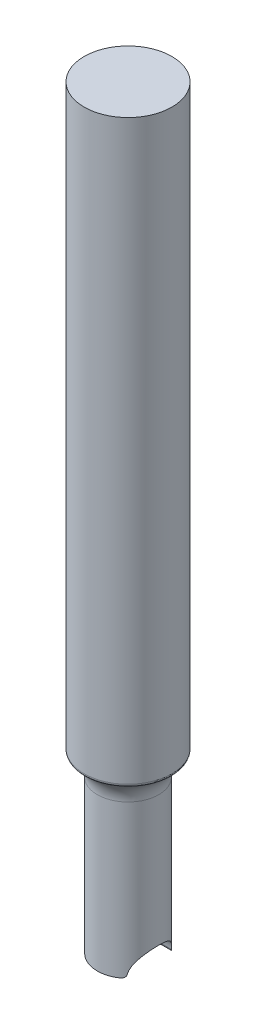
ISO-10303-21;
HEADER;
FILE_DESCRIPTION(('STEP AP214'),'2;1');
FILE_NAME('part.step','',(''),(''),'','','');
FILE_SCHEMA(('AUTOMOTIVE_DESIGN { 1 0 10303 214 1 1 1 1 }'));
ENDSEC;
DATA;
#1=APPLICATION_CONTEXT('core data for automotive mechanical design processes');
#2=APPLICATION_PROTOCOL_DEFINITION('international standard','automotive_design',2000,#1);
#3=PRODUCT_CONTEXT('',#1,'mechanical');
#4=PRODUCT('Part','Part','',(#3));
#5=PRODUCT_RELATED_PRODUCT_CATEGORY('part','',(#4));
#6=PRODUCT_DEFINITION_FORMATION('','',#4);
#7=PRODUCT_DEFINITION_CONTEXT('part definition',#1,'design');
#8=PRODUCT_DEFINITION('design','',#6,#7);
#9=PRODUCT_DEFINITION_SHAPE('','',#8);
#10=(LENGTH_UNIT() NAMED_UNIT(*) SI_UNIT(.MILLI.,.METRE.));
#11=(NAMED_UNIT(*) PLANE_ANGLE_UNIT() SI_UNIT($,.RADIAN.));
#12=(NAMED_UNIT(*) SI_UNIT($,.STERADIAN.) SOLID_ANGLE_UNIT());
#13=UNCERTAINTY_MEASURE_WITH_UNIT(LENGTH_MEASURE(1.E-05),#10,'distance_accuracy_value','');
#14=(GEOMETRIC_REPRESENTATION_CONTEXT(3) GLOBAL_UNCERTAINTY_ASSIGNED_CONTEXT((#13)) GLOBAL_UNIT_ASSIGNED_CONTEXT((#10,
#11,#12)) REPRESENTATION_CONTEXT('',''));
#15=CARTESIAN_POINT('',(0.,0.,0.));
#16=DIRECTION('',(0.,0.,1.));
#17=DIRECTION('',(1.,0.,0.));
#18=AXIS2_PLACEMENT_3D('',#15,#16,#17);
#19=CARTESIAN_POINT('',(0.,-25.4,0.));
#20=DIRECTION('',(0.,1.,0.));
#21=DIRECTION('',(0.,0.,1.));
#22=AXIS2_PLACEMENT_3D('',#19,#20,#21);
#23=PLANE('',#22);
#24=CARTESIAN_POINT('',(0.,-25.4,0.));
#25=DIRECTION('',(0.,1.,0.));
#26=DIRECTION('',(0.,0.,1.));
#27=AXIS2_PLACEMENT_3D('',#24,#25,#26);
#28=CIRCLE('',#27,4.445);
#29=CARTESIAN_POINT('',(-2.44536842827415,-25.4,3.71189954740157));
#30=VERTEX_POINT('',#29);
#31=CARTESIAN_POINT('',(2.44536842827415,-25.4,3.71189954740157));
#32=VERTEX_POINT('',#31);
#33=EDGE_CURVE('E92',#30,#32,#28,.T.);
#34=ORIENTED_EDGE('',*,*,#33,.F.);
#35=DIRECTION('',(1.,0.,0.));
#36=VECTOR('',#35,1.);
#37=CARTESIAN_POINT('',(0.,-25.4,3.71189954740157));
#38=LINE('',#37,#36);
#39=EDGE_CURVE('E11',#30,#32,#38,.T.);
#40=ORIENTED_EDGE('',*,*,#39,.T.);
#41=EDGE_LOOP('',(#34,#40));
#42=FACE_BOUND('',#41,.T.);
#43=ADVANCED_FACE('F39',(#42),#23,.F.);
#44=CARTESIAN_POINT('',(0.,83.82,0.));
#45=DIRECTION('',(0.,-1.,0.));
#46=DIRECTION('',(0.,0.,-1.));
#47=AXIS2_PLACEMENT_3D('',#44,#45,#46);
#48=CYLINDRICAL_SURFACE('',#47,6.35);
#49=CARTESIAN_POINT('',(0.,0.281302745268691,0.));
#50=DIRECTION('',(0.,-1.,0.));
#51=DIRECTION('',(0.,0.,-1.));
#52=AXIS2_PLACEMENT_3D('',#49,#50,#51);
#53=CIRCLE('',#52,6.35);
#54=CARTESIAN_POINT('',(0.,0.281302745268691,-6.35));
#55=VERTEX_POINT('',#54);
#56=EDGE_CURVE('E103',#55,#55,#53,.F.);
#57=ORIENTED_EDGE('',*,*,#56,.T.);
#58=EDGE_LOOP('',(#57));
#59=FACE_BOUND('',#58,.T.);
#60=CARTESIAN_POINT('',(0.,83.82,0.));
#61=DIRECTION('',(0.,1.,0.));
#62=DIRECTION('',(0.,0.,1.));
#63=AXIS2_PLACEMENT_3D('',#60,#61,#62);
#64=CIRCLE('',#63,6.35);
#65=CARTESIAN_POINT('',(0.,83.82,6.35));
#66=VERTEX_POINT('',#65);
#67=EDGE_CURVE('E94',#66,#66,#64,.T.);
#68=ORIENTED_EDGE('',*,*,#67,.F.);
#69=EDGE_LOOP('',(#68));
#70=FACE_BOUND('',#69,.T.);
#71=ADVANCED_FACE('F161',(#59,#70),#48,.T.);
#72=CARTESIAN_POINT('',(0.,83.82,0.));
#73=DIRECTION('',(0.,1.,0.));
#74=DIRECTION('',(0.,0.,1.));
#75=AXIS2_PLACEMENT_3D('',#72,#73,#74);
#76=PLANE('',#75);
#77=ORIENTED_EDGE('',*,*,#67,.T.);
#78=EDGE_LOOP('',(#77));
#79=FACE_BOUND('',#78,.T.);
#80=ADVANCED_FACE('F117',(#79),#76,.T.);
#81=CARTESIAN_POINT('',(0.,-25.4,0.));
#82=DIRECTION('',(0.,1.,0.));
#83=DIRECTION('',(0.,0.,1.));
#84=AXIS2_PLACEMENT_3D('',#81,#82,#83);
#85=CYLINDRICAL_SURFACE('',#84,4.445);
#86=CARTESIAN_POINT('',(2.44536842827415,-25.4,-3.71189954740157));
#87=VERTEX_POINT('',#86);
#88=CARTESIAN_POINT('',(-2.44536842827415,-25.4,-3.71189954740157));
#89=VERTEX_POINT('',#88);
#90=EDGE_CURVE('E81',#87,#89,#28,.T.);
#91=ORIENTED_EDGE('',*,*,#90,.T.);
#92=CARTESIAN_POINT('',(-2.44536842827415,-25.4,-3.71189954740157));
#93=CARTESIAN_POINT('',(-2.47735636897823,-25.399983898697,-3.69083266025942));
#94=CARTESIAN_POINT('',(-2.50909558964507,-25.3986867688102,-3.669323943575));
#95=CARTESIAN_POINT('',(-2.57200633765344,-25.3930941143963,-3.62550320364989));
#96=CARTESIAN_POINT('',(-2.60317363381565,-25.3887816564863,-3.60318732198382));
#97=CARTESIAN_POINT('',(-2.66493746841726,-25.3766269183203,-3.55775575622036));
#98=CARTESIAN_POINT('',(-2.69551963631302,-25.3687354281383,-3.53463321684989));
#99=CARTESIAN_POINT('',(-2.75517859618385,-25.3488518775097,-3.48832832424946));
#100=CARTESIAN_POINT('',(-2.78425912752254,-25.3368706307623,-3.46514628715513));
#101=CARTESIAN_POINT('',(-2.83603154759458,-25.3103715519963,-3.42284791777214));
#102=CARTESIAN_POINT('',(-2.85901273985272,-25.2965401156949,-3.40366104612556));
#103=CARTESIAN_POINT('',(-2.90300834204553,-25.2650457738632,-3.36621436323329));
#104=CARTESIAN_POINT('',(-2.92402546443731,-25.2473882676471,-3.3479532898708));
#105=CARTESIAN_POINT('',(-2.96371082106707,-25.2075326960651,-3.31287710734077));
#106=CARTESIAN_POINT('',(-2.98233767376959,-25.1852685948839,-3.29608874715065));
#107=CARTESIAN_POINT('',(-3.01572307862446,-25.1362909954903,-3.26557013022498));
#108=CARTESIAN_POINT('',(-3.03050188223043,-25.109602052789,-3.25182392318687));
#109=CARTESIAN_POINT('',(-3.05063020749444,-25.0624204827453,-3.23292461387663));
#110=CARTESIAN_POINT('',(-3.05746484426624,-25.0430890083935,-3.22645308511387));
#111=CARTESIAN_POINT('',(-3.06874813600373,-25.0029598683544,-3.21572158026461));
#112=CARTESIAN_POINT('',(-3.07317404498164,-24.9821502543822,-3.21148269907662));
#113=CARTESIAN_POINT('',(-3.07619374122761,-24.9608813559322,-3.20859113419458));
#114=B_SPLINE_CURVE_WITH_KNOTS('',3,(#92,#93,#94,#95,#96,#97,#98,#99,#100,#101,#102,#103,#104,
#105,#106,#107,#108,#109,#110,#111,#112,#113),.UNSPECIFIED.,.F.,.F.,(4,2,2,2,2,2,2,2,2,2,4),(0.,
0.114935253819393,0.230521196169898,0.347746966764257,0.464665152020999,0.563360636302092,
0.6619177391264,0.7619999934923,0.861544374510092,0.925771030703431,0.990594106141183),.UNSPECIFIED.);
#115=CARTESIAN_POINT('',(-3.07619374122761,-24.9608813559322,-3.20859113419458));
#116=VERTEX_POINT('',#115);
#117=EDGE_CURVE('E86',#89,#116,#114,.T.);
#118=ORIENTED_EDGE('',*,*,#117,.T.);
#119=CARTESIAN_POINT('',(-3.04469091206316,-25.4,3.2385));
#120=CARTESIAN_POINT('',(-3.04463501457511,-25.3227829190388,3.23852362398881));
#121=CARTESIAN_POINT('',(-3.0476269699606,-25.2456031918844,3.23573946671245));
#122=CARTESIAN_POINT('',(-3.05927055560037,-25.0921990767109,3.22474831913488));
#123=CARTESIAN_POINT('',(-3.06791173348939,-25.0159731888033,3.21655134351499));
#124=CARTESIAN_POINT('',(-3.09028583984496,-24.8659710161894,3.19505555921046));
#125=CARTESIAN_POINT('',(-3.10395652325404,-24.7921763245362,3.18181905261877));
#126=CARTESIAN_POINT('',(-3.13571848282549,-24.6465841123561,3.15052299878193));
#127=CARTESIAN_POINT('',(-3.15381161074949,-24.5747874425023,3.13246143089659));
#128=CARTESIAN_POINT('',(-3.21331054108659,-24.3639969920997,3.07178136357645));
#129=CARTESIAN_POINT('',(-3.26013620416133,-24.2284050266954,3.02248798676109));
#130=CARTESIAN_POINT('',(-3.36272413020834,-23.9674235981944,2.90792692787263));
#131=CARTESIAN_POINT('',(-3.41851708273087,-23.8420714855115,2.84260396668927));
#132=CARTESIAN_POINT('',(-3.54539562579196,-23.5791833304891,2.68336531027762));
#133=CARTESIAN_POINT('',(-3.61735919341776,-23.4439374909422,2.58636704693851));
#134=CARTESIAN_POINT('',(-3.76097919093719,-23.1896124270349,2.37268757030682));
#135=CARTESIAN_POINT('',(-3.83263542744169,-23.0705422488822,2.25599542437271));
#136=CARTESIAN_POINT('',(-3.94235774743699,-22.8950809330248,2.05503029713733));
#137=CARTESIAN_POINT('',(-3.98226477778402,-22.8328486011256,1.97679248458371));
#138=CARTESIAN_POINT('',(-4.05904104958174,-22.7152918801453,1.8139199285299));
#139=CARTESIAN_POINT('',(-4.09591166682149,-22.6599643565953,1.72928811583206));
#140=CARTESIAN_POINT('',(-4.16554863030361,-22.5569222424514,1.55405983803135));
#141=CARTESIAN_POINT('',(-4.19832025383074,-22.5091978410132,1.46347127624383));
#142=CARTESIAN_POINT('',(-4.2587961926473,-22.4220503673835,1.27683553185076));
#143=CARTESIAN_POINT('',(-4.28650297440932,-22.3826232531634,1.18079103620123));
#144=CARTESIAN_POINT('',(-4.34639425116467,-22.298025367917,0.942177443725427));
#145=CARTESIAN_POINT('',(-4.3755079744863,-22.2574903104058,0.797126958342061));
#146=CARTESIAN_POINT('',(-4.41923550175928,-22.1968858580611,0.500789531311265));
#147=CARTESIAN_POINT('',(-4.43386173385439,-22.1767989213265,0.349508051204502));
#148=CARTESIAN_POINT('',(-4.4474009553188,-22.158198683788,0.0445390155790578));
#149=CARTESIAN_POINT('',(-4.44627757291098,-22.1597353199686,-0.109153290303072));
#150=CARTESIAN_POINT('',(-4.42832397827729,-22.1844160378933,-0.413864221876423));
#151=CARTESIAN_POINT('',(-4.41148973338961,-22.2075656672578,-0.56488215096749));
#152=CARTESIAN_POINT('',(-4.36428748651281,-22.2731230118493,-0.855628853142713));
#153=CARTESIAN_POINT('',(-4.33432952238349,-22.3149479447907,-0.995558590299206));
#154=CARTESIAN_POINT('',(-4.26319285681044,-22.4157176551135,-1.26601363931461));
#155=CARTESIAN_POINT('',(-4.22201182285294,-22.4746659914551,-1.39653698908651));
#156=CARTESIAN_POINT('',(-4.12597517765704,-22.614962136051,-1.66016527219585));
#157=CARTESIAN_POINT('',(-4.07011147431638,-22.6980650703127,-1.79196242497871));
#158=CARTESIAN_POINT('',(-3.95141814137029,-22.8804058077636,-2.04042099719444));
#159=CARTESIAN_POINT('',(-3.88858215959724,-22.9796583632666,-2.15706840081689));
#160=CARTESIAN_POINT('',(-3.7475610024905,-23.2126969034373,-2.39507188014702));
#161=CARTESIAN_POINT('',(-3.66872415640257,-23.3494625898154,-2.5131288667004));
#162=CARTESIAN_POINT('',(-3.5136865740353,-23.6418036379969,-2.72567596518718));
#163=CARTESIAN_POINT('',(-3.43748729204232,-23.7973891706177,-2.82015324868712));
#164=CARTESIAN_POINT('',(-3.31208690872826,-24.0910428380792,-2.96568058635567));
#165=CARTESIAN_POINT('',(-3.26060622198569,-24.2256621624654,-3.02170157105747));
#166=CARTESIAN_POINT('',(-3.17084541598623,-24.5047966911866,-3.11576774320867));
#167=CARTESIAN_POINT('',(-3.13250750230748,-24.6492651309372,-3.15389191145322));
#168=CARTESIAN_POINT('',(-3.08474446441768,-24.8953082994337,-3.20048159070717));
#169=CARTESIAN_POINT('',(-3.06992038182991,-24.9947571099544,-3.21462451265105));
#170=CARTESIAN_POINT('',(-3.05488745124757,-25.1455871314794,-3.2288902663572));
#171=CARTESIAN_POINT('',(-3.051076484664,-25.1963057711384,-3.23248766247769));
#172=CARTESIAN_POINT('',(-3.04597303959414,-25.2980115489488,-3.23729495409034));
#173=CARTESIAN_POINT('',(-3.04468204100156,-25.3489988272517,-3.23850344666387));
#174=CARTESIAN_POINT('',(-3.04469091206316,-25.4,-3.2385));
#175=B_SPLINE_CURVE_WITH_KNOTS('',3,(#119,#120,#121,#122,#123,#124,#125,#126,#127,#128,#129,
#130,#131,#132,#133,#134,#135,#136,#137,#138,#139,#140,#141,#142,#143,#144,#145,#146,#147,#148,
#149,#150,#151,#152,#153,#154,#155,#156,#157,#158,#159,#160,#161,#162,#163,#164,#165,#166,#167,
#168,#169,#170,#171,#172,#173,#174),.UNSPECIFIED.,.F.,.F.,(4,2,2,2,2,2,2,2,2,2,2,2,2,2,2,2,2,2,
2,2,2,2,2,2,2,2,2,4),(0.,0.231483188316698,0.462539286867695,0.690827084797741,
0.919210635415079,1.37234275602033,1.82706005293908,2.36919095895382,2.9116238133834,
3.2341575115991,3.55654425744455,3.87851157528318,4.20032168159876,4.65838124198546,
5.11604751321218,5.57477088156215,6.03361202735036,6.47903925278616,6.92455912297249,
7.41929745005755,7.91449027310827,8.50355403606966,9.09293758138883,9.55532826415171,
10.0156587194569,10.3194000967155,10.4722573043451,10.6252042529729),.UNSPECIFIED.);
#176=CARTESIAN_POINT('',(-3.07619374122761,-24.9608813559322,3.20859113419458));
#177=VERTEX_POINT('',#176);
#178=EDGE_CURVE('E134',#177,#116,#175,.T.);
#179=ORIENTED_EDGE('',*,*,#178,.F.);
#180=CARTESIAN_POINT('',(-3.07619374122761,-24.9608813559322,3.20859113419458));
#181=CARTESIAN_POINT('',(-3.07281307098173,-24.9847651494615,3.21182791396686));
#182=CARTESIAN_POINT('',(-3.067647632525,-25.0080563303613,3.21677512736445));
#183=CARTESIAN_POINT('',(-3.05430776702419,-25.0527049891377,3.22944562550276));
#184=CARTESIAN_POINT('',(-3.04616402443686,-25.0740795117107,3.23714058273036));
#185=CARTESIAN_POINT('',(-3.02738542213801,-25.1145488270994,3.25470793333221));
#186=CARTESIAN_POINT('',(-3.01676267300753,-25.1336540423578,3.26456972787488));
#187=CARTESIAN_POINT('',(-2.99346602365788,-25.1696064519168,3.28594559788082));
#188=CARTESIAN_POINT('',(-2.98078656139854,-25.1864472901496,3.29746414390747));
#189=CARTESIAN_POINT('',(-2.94643816133572,-25.2263989121021,3.32825842054909));
#190=CARTESIAN_POINT('',(-2.92363881137343,-25.2479178291146,3.3483378049802));
#191=CARTESIAN_POINT('',(-2.87533291011181,-25.2859354009756,3.38991323034801));
#192=CARTESIAN_POINT('',(-2.84982067930178,-25.3024232325021,3.41141220613566));
#193=CARTESIAN_POINT('',(-2.78282318442186,-25.3385843823729,3.46650476867466));
#194=CARTESIAN_POINT('',(-2.74004979398578,-25.3553001397103,3.50045862440874));
#195=CARTESIAN_POINT('',(-2.65177248658745,-25.3804617150549,3.56780513492891));
#196=CARTESIAN_POINT('',(-2.60626414354188,-25.3888937226321,3.60119676162168));
#197=CARTESIAN_POINT('',(-2.54103877055546,-25.3960349422759,3.64714732249885));
#198=CARTESIAN_POINT('',(-2.52201492182049,-25.3975448156095,3.6603282560082));
#199=CARTESIAN_POINT('',(-2.48381677234502,-25.3995243295801,3.68635460545873));
#200=CARTESIAN_POINT('',(-2.46464360832944,-25.3999988550861,3.69920131316295));
#201=CARTESIAN_POINT('',(-2.44536842827416,-25.4,3.71189954740157));
#202=B_SPLINE_CURVE_WITH_KNOTS('',3,(#180,#181,#182,#183,#184,#185,#186,#187,#188,#189,#190,
#191,#192,#193,#194,#195,#196,#197,#198,#199,#200,#201),.UNSPECIFIED.,.F.,.F.,(4,2,2,2,2,2,2,2,
2,2,4),(0.,0.0727329787595142,0.14473680435088,0.216395976034261,0.288252271903851,
0.399310864059385,0.510606717819431,0.681001672516374,0.851680225136154,0.921240556494678,
0.990471979439484),.UNSPECIFIED.);
#203=EDGE_CURVE('E98',#177,#30,#202,.T.);
#204=ORIENTED_EDGE('',*,*,#203,.T.);
#205=ORIENTED_EDGE('',*,*,#33,.T.);
#206=CARTESIAN_POINT('',(2.44536842827415,-25.4,3.71189954740157));
#207=CARTESIAN_POINT('',(2.47735636897823,-25.399983898697,3.69083266025942));
#208=CARTESIAN_POINT('',(2.50909558964507,-25.3986867688102,3.669323943575));
#209=CARTESIAN_POINT('',(2.57200633765344,-25.3930941143963,3.62550320364989));
#210=CARTESIAN_POINT('',(2.60317363381565,-25.3887816564863,3.60318732198382));
#211=CARTESIAN_POINT('',(2.66493746841726,-25.3766269183203,3.55775575622036));
#212=CARTESIAN_POINT('',(2.69551963631302,-25.3687354281383,3.53463321684989));
#213=CARTESIAN_POINT('',(2.75517859618385,-25.3488518775097,3.48832832424946));
#214=CARTESIAN_POINT('',(2.78425912752254,-25.3368706307623,3.46514628715513));
#215=CARTESIAN_POINT('',(2.83603154759458,-25.3103715519963,3.42284791777214));
#216=CARTESIAN_POINT('',(2.85901273985272,-25.2965401156949,3.40366104612556));
#217=CARTESIAN_POINT('',(2.90300834204553,-25.2650457738632,3.36621436323329));
#218=CARTESIAN_POINT('',(2.92402546443731,-25.2473882676471,3.3479532898708));
#219=CARTESIAN_POINT('',(2.96371082106707,-25.2075326960651,3.31287710734077));
#220=CARTESIAN_POINT('',(2.98233767376959,-25.1852685948839,3.29608874715065));
#221=CARTESIAN_POINT('',(3.01572307862446,-25.1362909954903,3.26557013022498));
#222=CARTESIAN_POINT('',(3.03050188223043,-25.109602052789,3.25182392318687));
#223=CARTESIAN_POINT('',(3.05063020749444,-25.0624204827453,3.23292461387663));
#224=CARTESIAN_POINT('',(3.05746484426624,-25.0430890083935,3.22645308511387));
#225=CARTESIAN_POINT('',(3.06874813600373,-25.0029598683544,3.21572158026461));
#226=CARTESIAN_POINT('',(3.07317404498164,-24.9821502543822,3.21148269907662));
#227=CARTESIAN_POINT('',(3.07619374122761,-24.9608813559322,3.20859113419458));
#228=B_SPLINE_CURVE_WITH_KNOTS('',3,(#206,#207,#208,#209,#210,#211,#212,#213,#214,#215,#216,
#217,#218,#219,#220,#221,#222,#223,#224,#225,#226,#227),.UNSPECIFIED.,.F.,.F.,(4,2,2,2,2,2,2,2,
2,2,4),(0.,0.114935253819393,0.230521196169898,0.347746966764256,0.464665152020998,
0.563360636302092,0.6619177391264,0.7619999934923,0.861544374510092,0.925771030703431,
0.990594106141183),.UNSPECIFIED.);
#229=CARTESIAN_POINT('',(3.07619374122762,-24.9608813559322,3.20859113419458));
#230=VERTEX_POINT('',#229);
#231=EDGE_CURVE('E54',#32,#230,#228,.T.);
#232=ORIENTED_EDGE('',*,*,#231,.T.);
#233=CARTESIAN_POINT('',(3.04469091206316,-25.4,-3.2385));
#234=CARTESIAN_POINT('',(3.04463501457511,-25.3227829190388,-3.23852362398881));
#235=CARTESIAN_POINT('',(3.0476269699606,-25.2456031918844,-3.23573946671245));
#236=CARTESIAN_POINT('',(3.05927055560037,-25.0921990767109,-3.22474831913488));
#237=CARTESIAN_POINT('',(3.06791173348939,-25.0159731888033,-3.21655134351499));
#238=CARTESIAN_POINT('',(3.09028583984496,-24.8659710161894,-3.19505555921046));
#239=CARTESIAN_POINT('',(3.10395652325404,-24.7921763245362,-3.18181905261877));
#240=CARTESIAN_POINT('',(3.13571848282549,-24.6465841123561,-3.15052299878193));
#241=CARTESIAN_POINT('',(3.15381161074949,-24.5747874425023,-3.13246143089659));
#242=CARTESIAN_POINT('',(3.21331054108659,-24.3639969920997,-3.07178136357645));
#243=CARTESIAN_POINT('',(3.26013620416132,-24.2284050266954,-3.0224879867611));
#244=CARTESIAN_POINT('',(3.36272413020834,-23.9674235981944,-2.90792692787263));
#245=CARTESIAN_POINT('',(3.41851708273087,-23.8420714855115,-2.84260396668928));
#246=CARTESIAN_POINT('',(3.54539562579195,-23.5791833304891,-2.68336531027762));
#247=CARTESIAN_POINT('',(3.61735919341776,-23.4439374909422,-2.58636704693851));
#248=CARTESIAN_POINT('',(3.76097919093719,-23.1896124270349,-2.37268757030682));
#249=CARTESIAN_POINT('',(3.83263542744168,-23.0705422488822,-2.25599542437272));
#250=CARTESIAN_POINT('',(3.94235774743699,-22.8950809330248,-2.05503029713734));
#251=CARTESIAN_POINT('',(3.98226477778402,-22.8328486011256,-1.97679248458371));
#252=CARTESIAN_POINT('',(4.05904104958174,-22.7152918801453,-1.8139199285299));
#253=CARTESIAN_POINT('',(4.09591166682149,-22.6599643565953,-1.72928811583207));
#254=CARTESIAN_POINT('',(4.16554863030361,-22.5569222424514,-1.55405983803135));
#255=CARTESIAN_POINT('',(4.19832025383074,-22.5091978410132,-1.46347127624383));
#256=CARTESIAN_POINT('',(4.25879619264729,-22.4220503673835,-1.27683553185076));
#257=CARTESIAN_POINT('',(4.28650297440932,-22.3826232531634,-1.18079103620123));
#258=CARTESIAN_POINT('',(4.34639425116467,-22.298025367917,-0.942177443725432));
#259=CARTESIAN_POINT('',(4.3755079744863,-22.2574903104058,-0.797126958342066));
#260=CARTESIAN_POINT('',(4.41923550175928,-22.1968858580611,-0.50078953131127));
#261=CARTESIAN_POINT('',(4.43386173385439,-22.1767989213265,-0.349508051204507));
#262=CARTESIAN_POINT('',(4.4474009553188,-22.158198683788,-0.0445390155790621));
#263=CARTESIAN_POINT('',(4.44627757291098,-22.1597353199686,0.109153290303069));
#264=CARTESIAN_POINT('',(4.42832397827729,-22.1844160378933,0.413864221876419));
#265=CARTESIAN_POINT('',(4.41148973338961,-22.2075656672578,0.564882150967487));
#266=CARTESIAN_POINT('',(4.36428748651281,-22.2731230118493,0.855628853142709));
#267=CARTESIAN_POINT('',(4.33432952238349,-22.3149479447907,0.995558590299202));
#268=CARTESIAN_POINT('',(4.26319285681044,-22.4157176551135,1.26601363931461));
#269=CARTESIAN_POINT('',(4.22201182285294,-22.4746659914551,1.3965369890865));
#270=CARTESIAN_POINT('',(4.12597517765704,-22.614962136051,1.66016527219585));
#271=CARTESIAN_POINT('',(4.07011147431638,-22.6980650703127,1.79196242497871));
#272=CARTESIAN_POINT('',(3.95141814137029,-22.8804058077636,2.04042099719444));
#273=CARTESIAN_POINT('',(3.88858215959724,-22.9796583632666,2.15706840081689));
#274=CARTESIAN_POINT('',(3.7475610024905,-23.2126969034373,2.39507188014702));
#275=CARTESIAN_POINT('',(3.66872415640257,-23.3494625898154,2.5131288667004));
#276=CARTESIAN_POINT('',(3.51368657403531,-23.6418036379969,2.72567596518717));
#277=CARTESIAN_POINT('',(3.43748729204232,-23.7973891706177,2.82015324868712));
#278=CARTESIAN_POINT('',(3.31208690872826,-24.0910428380792,2.96568058635567));
#279=CARTESIAN_POINT('',(3.26060622198569,-24.2256621624654,3.02170157105747));
#280=CARTESIAN_POINT('',(3.17084541598624,-24.5047966911866,3.11576774320867));
#281=CARTESIAN_POINT('',(3.13250750230748,-24.6492651309372,3.15389191145322));
#282=CARTESIAN_POINT('',(3.08474446441768,-24.8953082994337,3.20048159070717));
#283=CARTESIAN_POINT('',(3.06992038182991,-24.9947571099544,3.21462451265105));
#284=CARTESIAN_POINT('',(3.05488745124757,-25.1455871314794,3.2288902663572));
#285=CARTESIAN_POINT('',(3.051076484664,-25.1963057711384,3.23248766247769));
#286=CARTESIAN_POINT('',(3.04597303959414,-25.2980115489488,3.23729495409034));
#287=CARTESIAN_POINT('',(3.04468204100156,-25.3489988272517,3.23850344666387));
#288=CARTESIAN_POINT('',(3.04469091206316,-25.4,3.2385));
#289=B_SPLINE_CURVE_WITH_KNOTS('',3,(#233,#234,#235,#236,#237,#238,#239,#240,#241,#242,#243,
#244,#245,#246,#247,#248,#249,#250,#251,#252,#253,#254,#255,#256,#257,#258,#259,#260,#261,#262,
#263,#264,#265,#266,#267,#268,#269,#270,#271,#272,#273,#274,#275,#276,#277,#278,#279,#280,#281,
#282,#283,#284,#285,#286,#287,#288),.UNSPECIFIED.,.F.,.F.,(4,2,2,2,2,2,2,2,2,2,2,2,2,2,2,2,2,2,
2,2,2,2,2,2,2,2,2,4),(0.,0.231483188316695,0.462539286867688,0.690827084797741,
0.919210635415076,1.37234275602032,1.82706005293908,2.36919095895381,2.91162381338339,
3.2341575115991,3.55654425744454,3.87851157528318,4.20032168159875,4.65838124198545,
5.11604751321217,5.57477088156215,6.03361202735036,6.47903925278616,6.92455912297249,
7.41929745005755,7.91449027310827,8.50355403606965,9.09293758138883,9.55532826415171,
10.0156587194568,10.3194000967155,10.4722573043451,10.6252042529729),.UNSPECIFIED.);
#290=CARTESIAN_POINT('',(3.07619374122761,-24.9608813559322,-3.20859113419458));
#291=VERTEX_POINT('',#290);
#292=EDGE_CURVE('E83',#291,#230,#289,.T.);
#293=ORIENTED_EDGE('',*,*,#292,.F.);
#294=CARTESIAN_POINT('',(3.07619374122761,-24.9608813559322,-3.20859113419458));
#295=CARTESIAN_POINT('',(3.07281307098173,-24.9847651494615,-3.21182791396686));
#296=CARTESIAN_POINT('',(3.067647632525,-25.0080563303613,-3.21677512736444));
#297=CARTESIAN_POINT('',(3.05430776702419,-25.0527049891377,-3.22944562550276));
#298=CARTESIAN_POINT('',(3.04616402443686,-25.0740795117107,-3.23714058273036));
#299=CARTESIAN_POINT('',(3.02738542213801,-25.1145488270994,-3.25470793333221));
#300=CARTESIAN_POINT('',(3.01676267300753,-25.1336540423578,-3.26456972787488));
#301=CARTESIAN_POINT('',(2.99346602365788,-25.1696064519168,-3.28594559788082));
#302=CARTESIAN_POINT('',(2.98078656139854,-25.1864472901496,-3.29746414390747));
#303=CARTESIAN_POINT('',(2.94643816133572,-25.2263989121021,-3.32825842054909));
#304=CARTESIAN_POINT('',(2.92363881137343,-25.2479178291146,-3.3483378049802));
#305=CARTESIAN_POINT('',(2.8753329101118,-25.2859354009756,-3.38991323034802));
#306=CARTESIAN_POINT('',(2.84982067930177,-25.3024232325021,-3.41141220613566));
#307=CARTESIAN_POINT('',(2.78282318442185,-25.3385843823729,-3.46650476867466));
#308=CARTESIAN_POINT('',(2.74004979398577,-25.3553001397103,-3.50045862440875));
#309=CARTESIAN_POINT('',(2.65177248658744,-25.3804617150549,-3.56780513492892));
#310=CARTESIAN_POINT('',(2.60626414354187,-25.3888937226321,-3.60119676162169));
#311=CARTESIAN_POINT('',(2.54103877055545,-25.3960349422759,-3.64714732249886));
#312=CARTESIAN_POINT('',(2.52201492182048,-25.3975448156095,-3.6603282560082));
#313=CARTESIAN_POINT('',(2.48381677234502,-25.3995243295801,-3.68635460545873));
#314=CARTESIAN_POINT('',(2.46464360832944,-25.3999988550861,-3.69920131316296));
#315=CARTESIAN_POINT('',(2.44536842827416,-25.4,-3.71189954740158));
#316=B_SPLINE_CURVE_WITH_KNOTS('',3,(#294,#295,#296,#297,#298,#299,#300,#301,#302,#303,#304,
#305,#306,#307,#308,#309,#310,#311,#312,#313,#314,#315),.UNSPECIFIED.,.F.,.F.,(4,2,2,2,2,2,2,2,
2,2,4),(0.,0.0727329787595142,0.14473680435088,0.216395976034263,0.288252271903856,
0.399310864059389,0.51060671781944,0.681001672516387,0.851680225136171,0.921240556494687,
0.990471979439484),.UNSPECIFIED.);
#317=EDGE_CURVE('E77',#291,#87,#316,.T.);
#318=ORIENTED_EDGE('',*,*,#317,.T.);
#319=EDGE_LOOP('',(#91,#118,#179,#204,#205,#232,#293,#318));
#320=FACE_BOUND('',#319,.T.);
#321=CARTESIAN_POINT('',(0.,-3.29955678841871,0.));
#322=DIRECTION('',(0.,1.,0.));
#323=DIRECTION('',(0.,0.,1.));
#324=AXIS2_PLACEMENT_3D('',#321,#322,#323);
#325=CIRCLE('',#324,4.445);
#326=CARTESIAN_POINT('',(0.,-3.29955678841871,4.445));
#327=VERTEX_POINT('',#326);
#328=EDGE_CURVE('E172',#327,#327,#325,.F.);
#329=ORIENTED_EDGE('',*,*,#328,.T.);
#330=EDGE_LOOP('',(#329));
#331=FACE_BOUND('',#330,.T.);
#332=ADVANCED_FACE('F85',(#320,#331),#85,.T.);
#333=ORIENTED_EDGE('',*,*,#90,.F.);
#334=DIRECTION('',(1.,0.,0.));
#335=VECTOR('',#334,1.);
#336=CARTESIAN_POINT('',(0.,-25.4,-3.71189954740157));
#337=LINE('',#336,#335);
#338=EDGE_CURVE('E91',#87,#89,#337,.F.);
#339=ORIENTED_EDGE('',*,*,#338,.T.);
#340=EDGE_LOOP('',(#333,#339));
#341=FACE_BOUND('',#340,.T.);
#342=ADVANCED_FACE('F95',(#341),#23,.F.);
#343=CARTESIAN_POINT('',(0.,-3.29955678841871,0.));
#344=DIRECTION('',(0.,1.,0.));
#345=DIRECTION('',(0.,0.,1.));
#346=AXIS2_PLACEMENT_3D('',#343,#344,#345);
#347=TOROIDAL_SURFACE('',#346,8.255,3.81);
#348=CARTESIAN_POINT('',(0.,-0.139974846929829,0.));
#349=DIRECTION('',(0.,-1.,0.));
#350=DIRECTION('',(0.,0.,-1.));
#351=AXIS2_PLACEMENT_3D('',#348,#349,#350);
#352=CIRCLE('',#351,6.12588235294118);
#353=CARTESIAN_POINT('',(0.,-0.139974846929829,-6.12588235294118));
#354=VERTEX_POINT('',#353);
#355=EDGE_CURVE('E97',#354,#354,#352,.T.);
#356=ORIENTED_EDGE('',*,*,#355,.T.);
#357=EDGE_LOOP('',(#356));
#358=FACE_BOUND('',#357,.T.);
#359=ORIENTED_EDGE('',*,*,#328,.F.);
#360=EDGE_LOOP('',(#359));
#361=FACE_BOUND('',#360,.T.);
#362=ADVANCED_FACE('F158',(#358,#361),#347,.F.);
#363=CARTESIAN_POINT('',(-7.62,-25.4,0.));
#364=DIRECTION('',(1.,0.,0.));
#365=DIRECTION('',(0.,0.,-1.));
#366=AXIS2_PLACEMENT_3D('',#363,#364,#365);
#367=CYLINDRICAL_SURFACE('',#366,3.2385);
#368=ORIENTED_EDGE('',*,*,#178,.T.);
#369=DIRECTION('',(1.,0.,0.));
#370=VECTOR('',#369,1.);
#371=CARTESIAN_POINT('',(-7.62,-24.9608813559322,-3.20859113419458));
#372=LINE('',#371,#370);
#373=EDGE_CURVE('E48',#116,#291,#372,.T.);
#374=ORIENTED_EDGE('',*,*,#373,.T.);
#375=ORIENTED_EDGE('',*,*,#292,.T.);
#376=DIRECTION('',(1.,0.,0.));
#377=VECTOR('',#376,1.);
#378=CARTESIAN_POINT('',(-7.62,-24.9608813559322,3.20859113419458));
#379=LINE('',#378,#377);
#380=EDGE_CURVE('E185',#230,#177,#379,.F.);
#381=ORIENTED_EDGE('',*,*,#380,.T.);
#382=EDGE_LOOP('',(#368,#374,#375,#381));
#383=FACE_BOUND('',#382,.T.);
#384=ADVANCED_FACE('F156',(#383),#367,.F.);
#385=CARTESIAN_POINT('',(0.,0.281302745268691,0.));
#386=DIRECTION('',(0.,-1.,0.));
#387=DIRECTION('',(0.,0.,-1.));
#388=AXIS2_PLACEMENT_3D('',#385,#386,#387);
#389=TOROIDAL_SURFACE('',#388,5.842,0.508);
#390=ORIENTED_EDGE('',*,*,#355,.F.);
#391=EDGE_LOOP('',(#390));
#392=FACE_BOUND('',#391,.T.);
#393=ORIENTED_EDGE('',*,*,#56,.F.);
#394=EDGE_LOOP('',(#393));
#395=FACE_BOUND('',#394,.T.);
#396=ADVANCED_FACE('F155',(#392,#395),#389,.T.);
#397=CARTESIAN_POINT('',(-7.62,-24.892,-3.71189954740157));
#398=DIRECTION('',(1.,0.,0.));
#399=DIRECTION('',(0.,0.,-1.));
#400=AXIS2_PLACEMENT_3D('',#397,#398,#399);
#401=CYLINDRICAL_SURFACE('',#400,0.508);
#402=ORIENTED_EDGE('',*,*,#317,.F.);
#403=ORIENTED_EDGE('',*,*,#373,.F.);
#404=ORIENTED_EDGE('',*,*,#117,.F.);
#405=ORIENTED_EDGE('',*,*,#338,.F.);
#406=EDGE_LOOP('',(#402,#403,#404,#405));
#407=FACE_BOUND('',#406,.T.);
#408=ADVANCED_FACE('F100',(#407),#401,.T.);
#409=CARTESIAN_POINT('',(-7.62,-24.892,3.71189954740157));
#410=DIRECTION('',(1.,0.,0.));
#411=DIRECTION('',(0.,0.,-1.));
#412=AXIS2_PLACEMENT_3D('',#409,#410,#411);
#413=CYLINDRICAL_SURFACE('',#412,0.508);
#414=ORIENTED_EDGE('',*,*,#203,.F.);
#415=ORIENTED_EDGE('',*,*,#380,.F.);
#416=ORIENTED_EDGE('',*,*,#231,.F.);
#417=ORIENTED_EDGE('',*,*,#39,.F.);
#418=EDGE_LOOP('',(#414,#415,#416,#417));
#419=FACE_BOUND('',#418,.T.);
#420=ADVANCED_FACE('F41',(#419),#413,.T.);
#421=CLOSED_SHELL('',(#43,#71,#80,#332,#342,#362,#384,#396,#408,#420));
#422=MANIFOLD_SOLID_BREP('B2',#421);
#423=ADVANCED_BREP_SHAPE_REPRESENTATION('',(#18,#422),#14);
#424=SHAPE_DEFINITION_REPRESENTATION(#9,#423);
ENDSEC;
END-ISO-10303-21;
